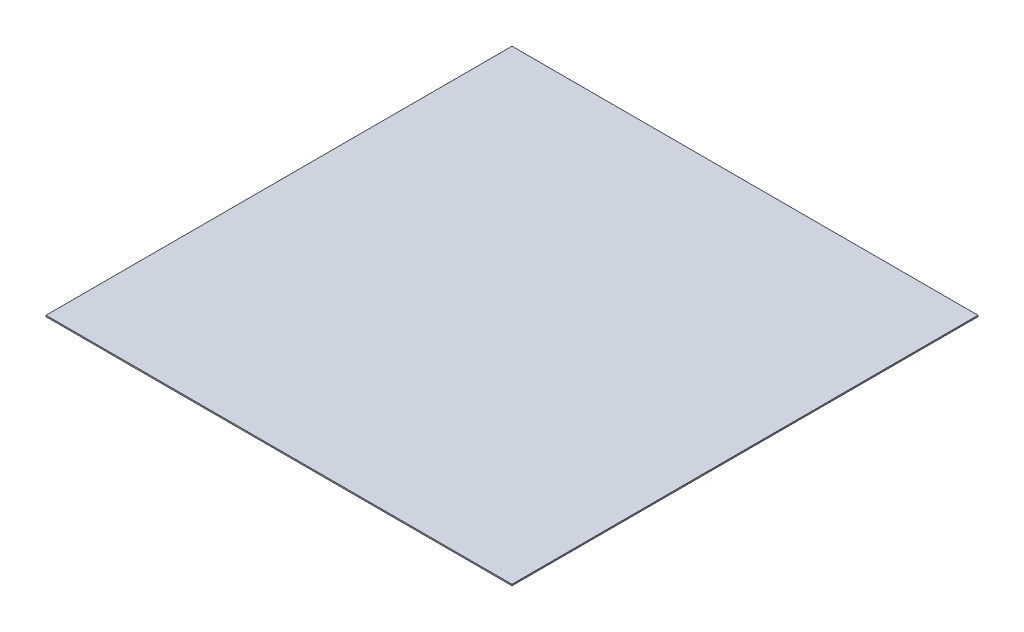
ISO-10303-21;
HEADER;
FILE_DESCRIPTION(('STEP AP214'),'2;1');
FILE_NAME('part.step','',(''),(''),'','','');
FILE_SCHEMA(('AUTOMOTIVE_DESIGN { 1 0 10303 214 1 1 1 1 }'));
ENDSEC;
DATA;
#1=APPLICATION_CONTEXT('core data for automotive mechanical design processes');
#2=APPLICATION_PROTOCOL_DEFINITION('international standard','automotive_design',2000,#1);
#3=PRODUCT_CONTEXT('',#1,'mechanical');
#4=PRODUCT('Part','Part','',(#3));
#5=PRODUCT_RELATED_PRODUCT_CATEGORY('part','',(#4));
#6=PRODUCT_DEFINITION_FORMATION('','',#4);
#7=PRODUCT_DEFINITION_CONTEXT('part definition',#1,'design');
#8=PRODUCT_DEFINITION('design','',#6,#7);
#9=PRODUCT_DEFINITION_SHAPE('','',#8);
#10=(LENGTH_UNIT() NAMED_UNIT(*) SI_UNIT(.MILLI.,.METRE.));
#11=(NAMED_UNIT(*) PLANE_ANGLE_UNIT() SI_UNIT($,.RADIAN.));
#12=(NAMED_UNIT(*) SI_UNIT($,.STERADIAN.) SOLID_ANGLE_UNIT());
#13=UNCERTAINTY_MEASURE_WITH_UNIT(LENGTH_MEASURE(1.E-05),#10,'distance_accuracy_value','');
#14=(GEOMETRIC_REPRESENTATION_CONTEXT(3) GLOBAL_UNCERTAINTY_ASSIGNED_CONTEXT((#13)) GLOBAL_UNIT_ASSIGNED_CONTEXT((#10,
#11,#12)) REPRESENTATION_CONTEXT('',''));
#15=CARTESIAN_POINT('',(0.,0.,0.));
#16=DIRECTION('',(0.,0.,1.));
#17=DIRECTION('',(1.,0.,0.));
#18=AXIS2_PLACEMENT_3D('',#15,#16,#17);
#19=CARTESIAN_POINT('',(-457.2,1.27,457.2));
#20=DIRECTION('',(-1.,0.,0.));
#21=DIRECTION('',(0.,0.,1.));
#22=AXIS2_PLACEMENT_3D('',#19,#20,#21);
#23=PLANE('',#22);
#24=DIRECTION('',(0.,0.,-1.));
#25=VECTOR('',#24,1.);
#26=CARTESIAN_POINT('',(-457.2,-1.27,457.2));
#27=LINE('',#26,#25);
#28=CARTESIAN_POINT('',(-457.2,-1.27,457.2));
#29=VERTEX_POINT('',#28);
#30=CARTESIAN_POINT('',(-457.2,-1.27,-457.2));
#31=VERTEX_POINT('',#30);
#32=EDGE_CURVE('E110',#29,#31,#27,.T.);
#33=ORIENTED_EDGE('',*,*,#32,.F.);
#34=DIRECTION('',(0.,-1.,0.));
#35=VECTOR('',#34,1.);
#36=CARTESIAN_POINT('',(-457.2,1.27,457.2));
#37=LINE('',#36,#35);
#38=CARTESIAN_POINT('',(-457.2,1.27,457.2));
#39=VERTEX_POINT('',#38);
#40=EDGE_CURVE('E11',#39,#29,#37,.T.);
#41=ORIENTED_EDGE('',*,*,#40,.F.);
#42=DIRECTION('',(0.,0.,-1.));
#43=VECTOR('',#42,1.);
#44=CARTESIAN_POINT('',(-457.2,1.27,457.2));
#45=LINE('',#44,#43);
#46=CARTESIAN_POINT('',(-457.2,1.27,-457.2));
#47=VERTEX_POINT('',#46);
#48=EDGE_CURVE('E103',#39,#47,#45,.T.);
#49=ORIENTED_EDGE('',*,*,#48,.T.);
#50=DIRECTION('',(0.,-1.,0.));
#51=VECTOR('',#50,1.);
#52=CARTESIAN_POINT('',(-457.2,1.27,-457.2));
#53=LINE('',#52,#51);
#54=EDGE_CURVE('E42',#47,#31,#53,.T.);
#55=ORIENTED_EDGE('',*,*,#54,.T.);
#56=EDGE_LOOP('',(#33,#41,#49,#55));
#57=FACE_BOUND('',#56,.T.);
#58=ADVANCED_FACE('F39',(#57),#23,.T.);
#59=CARTESIAN_POINT('',(-457.2,1.27,457.2));
#60=DIRECTION('',(0.,0.,-1.));
#61=DIRECTION('',(-1.,0.,0.));
#62=AXIS2_PLACEMENT_3D('',#59,#60,#61);
#63=PLANE('',#62);
#64=DIRECTION('',(1.,0.,0.));
#65=VECTOR('',#64,1.);
#66=CARTESIAN_POINT('',(-457.2,-1.27,457.2));
#67=LINE('',#66,#65);
#68=CARTESIAN_POINT('',(457.2,-1.27,457.2));
#69=VERTEX_POINT('',#68);
#70=EDGE_CURVE('E73',#29,#69,#67,.T.);
#71=ORIENTED_EDGE('',*,*,#70,.T.);
#72=DIRECTION('',(0.,-1.,0.));
#73=VECTOR('',#72,1.);
#74=CARTESIAN_POINT('',(457.2,1.27,457.2));
#75=LINE('',#74,#73);
#76=CARTESIAN_POINT('',(457.2,1.27,457.2));
#77=VERTEX_POINT('',#76);
#78=EDGE_CURVE('E49',#77,#69,#75,.T.);
#79=ORIENTED_EDGE('',*,*,#78,.F.);
#80=DIRECTION('',(1.,0.,0.));
#81=VECTOR('',#80,1.);
#82=CARTESIAN_POINT('',(-457.2,1.27,457.2));
#83=LINE('',#82,#81);
#84=EDGE_CURVE('E90',#39,#77,#83,.T.);
#85=ORIENTED_EDGE('',*,*,#84,.F.);
#86=ORIENTED_EDGE('',*,*,#40,.T.);
#87=EDGE_LOOP('',(#71,#79,#85,#86));
#88=FACE_BOUND('',#87,.T.);
#89=ADVANCED_FACE('F126',(#88),#63,.F.);
#90=CARTESIAN_POINT('',(457.2,1.27,457.2));
#91=DIRECTION('',(-1.,0.,0.));
#92=DIRECTION('',(0.,0.,1.));
#93=AXIS2_PLACEMENT_3D('',#90,#91,#92);
#94=PLANE('',#93);
#95=DIRECTION('',(0.,0.,-1.));
#96=VECTOR('',#95,1.);
#97=CARTESIAN_POINT('',(457.2,-1.27,457.2));
#98=LINE('',#97,#96);
#99=CARTESIAN_POINT('',(457.2,-1.27,-457.2));
#100=VERTEX_POINT('',#99);
#101=EDGE_CURVE('E98',#69,#100,#98,.T.);
#102=ORIENTED_EDGE('',*,*,#101,.T.);
#103=DIRECTION('',(0.,-1.,0.));
#104=VECTOR('',#103,1.);
#105=CARTESIAN_POINT('',(457.2,1.27,-457.2));
#106=LINE('',#105,#104);
#107=CARTESIAN_POINT('',(457.2,1.27,-457.2));
#108=VERTEX_POINT('',#107);
#109=EDGE_CURVE('E95',#108,#100,#106,.T.);
#110=ORIENTED_EDGE('',*,*,#109,.F.);
#111=DIRECTION('',(0.,0.,-1.));
#112=VECTOR('',#111,1.);
#113=CARTESIAN_POINT('',(457.2,1.27,457.2));
#114=LINE('',#113,#112);
#115=EDGE_CURVE('E85',#77,#108,#114,.T.);
#116=ORIENTED_EDGE('',*,*,#115,.F.);
#117=ORIENTED_EDGE('',*,*,#78,.T.);
#118=EDGE_LOOP('',(#102,#110,#116,#117));
#119=FACE_BOUND('',#118,.T.);
#120=ADVANCED_FACE('F96',(#119),#94,.F.);
#121=CARTESIAN_POINT('',(-457.2,1.27,-457.2));
#122=DIRECTION('',(0.,0.,-1.));
#123=DIRECTION('',(-1.,0.,0.));
#124=AXIS2_PLACEMENT_3D('',#121,#122,#123);
#125=PLANE('',#124);
#126=DIRECTION('',(1.,0.,0.));
#127=VECTOR('',#126,1.);
#128=CARTESIAN_POINT('',(-457.2,-1.27,-457.2));
#129=LINE('',#128,#127);
#130=EDGE_CURVE('E114',#31,#100,#129,.T.);
#131=ORIENTED_EDGE('',*,*,#130,.F.);
#132=ORIENTED_EDGE('',*,*,#54,.F.);
#133=DIRECTION('',(1.,0.,0.));
#134=VECTOR('',#133,1.);
#135=CARTESIAN_POINT('',(-457.2,1.27,-457.2));
#136=LINE('',#135,#134);
#137=EDGE_CURVE('E89',#47,#108,#136,.T.);
#138=ORIENTED_EDGE('',*,*,#137,.T.);
#139=ORIENTED_EDGE('',*,*,#109,.T.);
#140=EDGE_LOOP('',(#131,#132,#138,#139));
#141=FACE_BOUND('',#140,.T.);
#142=ADVANCED_FACE('F101',(#141),#125,.T.);
#143=CARTESIAN_POINT('',(0.,1.27,0.));
#144=DIRECTION('',(0.,-1.,0.));
#145=DIRECTION('',(0.,0.,-1.));
#146=AXIS2_PLACEMENT_3D('',#143,#144,#145);
#147=PLANE('',#146);
#148=ORIENTED_EDGE('',*,*,#48,.F.);
#149=ORIENTED_EDGE('',*,*,#84,.T.);
#150=ORIENTED_EDGE('',*,*,#115,.T.);
#151=ORIENTED_EDGE('',*,*,#137,.F.);
#152=EDGE_LOOP('',(#148,#149,#150,#151));
#153=FACE_BOUND('',#152,.T.);
#154=ADVANCED_FACE('F88',(#153),#147,.F.);
#155=CARTESIAN_POINT('',(0.,-1.27,0.));
#156=DIRECTION('',(0.,-1.,0.));
#157=DIRECTION('',(0.,0.,-1.));
#158=AXIS2_PLACEMENT_3D('',#155,#156,#157);
#159=PLANE('',#158);
#160=ORIENTED_EDGE('',*,*,#32,.T.);
#161=ORIENTED_EDGE('',*,*,#130,.T.);
#162=ORIENTED_EDGE('',*,*,#101,.F.);
#163=ORIENTED_EDGE('',*,*,#70,.F.);
#164=EDGE_LOOP('',(#160,#161,#162,#163));
#165=FACE_BOUND('',#164,.T.);
#166=ADVANCED_FACE('F123',(#165),#159,.T.);
#167=CLOSED_SHELL('',(#58,#89,#120,#142,#154,#166));
#168=MANIFOLD_SOLID_BREP('B2',#167);
#169=ADVANCED_BREP_SHAPE_REPRESENTATION('',(#18,#168),#14);
#170=SHAPE_DEFINITION_REPRESENTATION(#9,#169);
ENDSEC;
END-ISO-10303-21;
